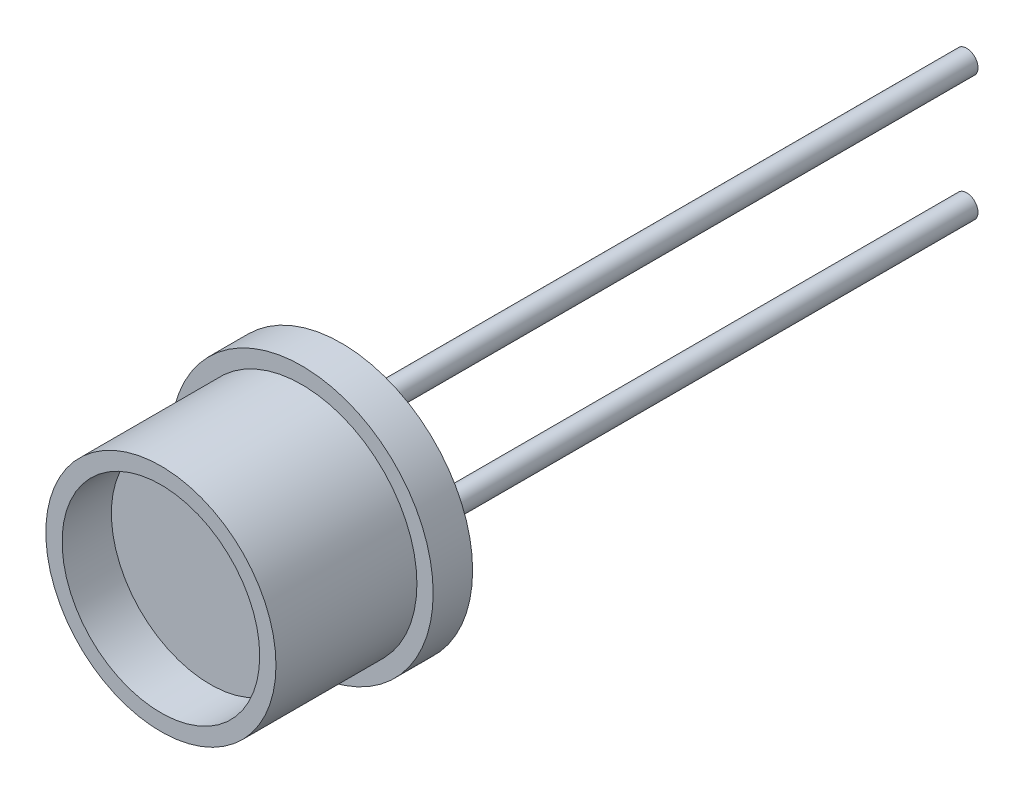
ISO-10303-21;
HEADER;
FILE_DESCRIPTION(('STEP AP214'),'2;1');
FILE_NAME('part.step','',(''),(''),'','','');
FILE_SCHEMA(('AUTOMOTIVE_DESIGN { 1 0 10303 214 1 1 1 1 }'));
ENDSEC;
DATA;
#1=APPLICATION_CONTEXT('core data for automotive mechanical design processes');
#2=APPLICATION_PROTOCOL_DEFINITION('international standard','automotive_design',2000,#1);
#3=PRODUCT_CONTEXT('',#1,'mechanical');
#4=PRODUCT('Part','Part','',(#3));
#5=PRODUCT_RELATED_PRODUCT_CATEGORY('part','',(#4));
#6=PRODUCT_DEFINITION_FORMATION('','',#4);
#7=PRODUCT_DEFINITION_CONTEXT('part definition',#1,'design');
#8=PRODUCT_DEFINITION('design','',#6,#7);
#9=PRODUCT_DEFINITION_SHAPE('','',#8);
#10=(LENGTH_UNIT() NAMED_UNIT(*) SI_UNIT(.MILLI.,.METRE.));
#11=(NAMED_UNIT(*) PLANE_ANGLE_UNIT() SI_UNIT($,.RADIAN.));
#12=(NAMED_UNIT(*) SI_UNIT($,.STERADIAN.) SOLID_ANGLE_UNIT());
#13=UNCERTAINTY_MEASURE_WITH_UNIT(LENGTH_MEASURE(1.E-05),#10,'distance_accuracy_value','');
#14=(GEOMETRIC_REPRESENTATION_CONTEXT(3) GLOBAL_UNCERTAINTY_ASSIGNED_CONTEXT((#13)) GLOBAL_UNIT_ASSIGNED_CONTEXT((#10,
#11,#12)) REPRESENTATION_CONTEXT('',''));
#15=CARTESIAN_POINT('',(0.,0.,0.));
#16=DIRECTION('',(0.,0.,1.));
#17=DIRECTION('',(1.,0.,0.));
#18=AXIS2_PLACEMENT_3D('',#15,#16,#17);
#19=CARTESIAN_POINT('',(0.,0.,0.8));
#20=DIRECTION('',(0.,0.,-1.));
#21=DIRECTION('',(-1.,0.,0.));
#22=AXIS2_PLACEMENT_3D('',#19,#20,#21);
#23=CYLINDRICAL_SURFACE('',#22,2.665);
#24=CARTESIAN_POINT('',(0.,0.,0.8));
#25=DIRECTION('',(0.,0.,1.));
#26=DIRECTION('',(1.,0.,0.));
#27=AXIS2_PLACEMENT_3D('',#24,#25,#26);
#28=CIRCLE('',#27,2.665);
#29=CARTESIAN_POINT('',(2.665,0.,0.8));
#30=VERTEX_POINT('',#29);
#31=EDGE_CURVE('E59',#30,#30,#28,.T.);
#32=ORIENTED_EDGE('',*,*,#31,.F.);
#33=EDGE_LOOP('',(#32));
#34=FACE_BOUND('',#33,.T.);
#35=CARTESIAN_POINT('',(0.,0.,0.));
#36=DIRECTION('',(0.,0.,1.));
#37=DIRECTION('',(1.,0.,0.));
#38=AXIS2_PLACEMENT_3D('',#35,#36,#37);
#39=CIRCLE('',#38,2.665);
#40=CARTESIAN_POINT('',(2.665,0.,0.));
#41=VERTEX_POINT('',#40);
#42=EDGE_CURVE('E56',#41,#41,#39,.T.);
#43=ORIENTED_EDGE('',*,*,#42,.T.);
#44=EDGE_LOOP('',(#43));
#45=FACE_BOUND('',#44,.T.);
#46=ADVANCED_FACE('F39',(#34,#45),#23,.T.);
#47=CARTESIAN_POINT('',(0.,0.,0.8));
#48=DIRECTION('',(0.,0.,1.));
#49=DIRECTION('',(1.,0.,0.));
#50=AXIS2_PLACEMENT_3D('',#47,#48,#49);
#51=PLANE('',#50);
#52=CARTESIAN_POINT('',(0.,0.,0.8));
#53=DIRECTION('',(0.,0.,1.));
#54=DIRECTION('',(1.,0.,0.));
#55=AXIS2_PLACEMENT_3D('',#52,#53,#54);
#56=CIRCLE('',#55,2.335);
#57=CARTESIAN_POINT('',(2.335,0.,0.8));
#58=VERTEX_POINT('',#57);
#59=EDGE_CURVE('E53',#58,#58,#56,.T.);
#60=ORIENTED_EDGE('',*,*,#59,.F.);
#61=EDGE_LOOP('',(#60));
#62=FACE_BOUND('',#61,.T.);
#63=ORIENTED_EDGE('',*,*,#31,.T.);
#64=EDGE_LOOP('',(#63));
#65=FACE_BOUND('',#64,.T.);
#66=ADVANCED_FACE('F106',(#62,#65),#51,.T.);
#67=CARTESIAN_POINT('',(0.,0.,0.));
#68=DIRECTION('',(0.,0.,1.));
#69=DIRECTION('',(1.,0.,0.));
#70=AXIS2_PLACEMENT_3D('',#67,#68,#69);
#71=PLANE('',#70);
#72=CARTESIAN_POINT('',(-1.27,0.,0.));
#73=DIRECTION('',(0.,0.,1.));
#74=DIRECTION('',(1.,0.,0.));
#75=AXIS2_PLACEMENT_3D('',#72,#73,#74);
#76=CIRCLE('',#75,0.23);
#77=CARTESIAN_POINT('',(-1.04,0.,0.));
#78=VERTEX_POINT('',#77);
#79=EDGE_CURVE('E10',#78,#78,#76,.F.);
#80=ORIENTED_EDGE('',*,*,#79,.F.);
#81=EDGE_LOOP('',(#80));
#82=FACE_BOUND('',#81,.T.);
#83=CARTESIAN_POINT('',(0.,-1.27,0.));
#84=DIRECTION('',(0.,0.,1.));
#85=DIRECTION('',(1.,0.,0.));
#86=AXIS2_PLACEMENT_3D('',#83,#84,#85);
#87=CIRCLE('',#86,0.23);
#88=CARTESIAN_POINT('',(0.23,-1.27,0.));
#89=VERTEX_POINT('',#88);
#90=EDGE_CURVE('E45',#89,#89,#87,.F.);
#91=ORIENTED_EDGE('',*,*,#90,.F.);
#92=EDGE_LOOP('',(#91));
#93=FACE_BOUND('',#92,.T.);
#94=CARTESIAN_POINT('',(0.,1.27,0.));
#95=DIRECTION('',(0.,0.,1.));
#96=DIRECTION('',(1.,0.,0.));
#97=AXIS2_PLACEMENT_3D('',#94,#95,#96);
#98=CIRCLE('',#97,0.23);
#99=CARTESIAN_POINT('',(0.23,1.27,0.));
#100=VERTEX_POINT('',#99);
#101=EDGE_CURVE('E49',#100,#100,#98,.F.);
#102=ORIENTED_EDGE('',*,*,#101,.F.);
#103=EDGE_LOOP('',(#102));
#104=FACE_BOUND('',#103,.T.);
#105=ORIENTED_EDGE('',*,*,#42,.F.);
#106=EDGE_LOOP('',(#105));
#107=FACE_BOUND('',#106,.T.);
#108=ADVANCED_FACE('F102',(#82,#93,#104,#107),#71,.F.);
#109=CARTESIAN_POINT('',(0.,0.,3.66));
#110=DIRECTION('',(0.,0.,-1.));
#111=DIRECTION('',(-1.,0.,0.));
#112=AXIS2_PLACEMENT_3D('',#109,#110,#111);
#113=CYLINDRICAL_SURFACE('',#112,2.335);
#114=CARTESIAN_POINT('',(0.,0.,3.66));
#115=DIRECTION('',(0.,0.,1.));
#116=DIRECTION('',(1.,0.,0.));
#117=AXIS2_PLACEMENT_3D('',#114,#115,#116);
#118=CIRCLE('',#117,2.335);
#119=CARTESIAN_POINT('',(2.335,0.,3.66));
#120=VERTEX_POINT('',#119);
#121=EDGE_CURVE('E60',#120,#120,#118,.T.);
#122=ORIENTED_EDGE('',*,*,#121,.F.);
#123=EDGE_LOOP('',(#122));
#124=FACE_BOUND('',#123,.T.);
#125=ORIENTED_EDGE('',*,*,#59,.T.);
#126=EDGE_LOOP('',(#125));
#127=FACE_BOUND('',#126,.T.);
#128=ADVANCED_FACE('F96',(#124,#127),#113,.T.);
#129=CARTESIAN_POINT('',(0.,0.,3.66));
#130=DIRECTION('',(0.,0.,1.));
#131=DIRECTION('',(1.,0.,0.));
#132=AXIS2_PLACEMENT_3D('',#129,#130,#131);
#133=PLANE('',#132);
#134=CARTESIAN_POINT('',(0.,0.,3.66));
#135=DIRECTION('',(0.,0.,1.));
#136=DIRECTION('',(1.,0.,0.));
#137=AXIS2_PLACEMENT_3D('',#134,#135,#136);
#138=CIRCLE('',#137,2.005);
#139=CARTESIAN_POINT('',(2.005,0.,3.66));
#140=VERTEX_POINT('',#139);
#141=EDGE_CURVE('E77',#140,#140,#138,.T.);
#142=ORIENTED_EDGE('',*,*,#141,.F.);
#143=EDGE_LOOP('',(#142));
#144=FACE_BOUND('',#143,.T.);
#145=ORIENTED_EDGE('',*,*,#121,.T.);
#146=EDGE_LOOP('',(#145));
#147=FACE_BOUND('',#146,.T.);
#148=ADVANCED_FACE('F92',(#144,#147),#133,.T.);
#149=CARTESIAN_POINT('',(0.,1.27,-12.69));
#150=DIRECTION('',(0.,0.,1.));
#151=DIRECTION('',(1.,0.,0.));
#152=AXIS2_PLACEMENT_3D('',#149,#150,#151);
#153=CYLINDRICAL_SURFACE('',#152,0.23);
#154=CARTESIAN_POINT('',(0.,1.27,-12.69));
#155=DIRECTION('',(0.,0.,-1.));
#156=DIRECTION('',(-1.,0.,0.));
#157=AXIS2_PLACEMENT_3D('',#154,#155,#156);
#158=CIRCLE('',#157,0.23);
#159=CARTESIAN_POINT('',(-0.23,1.27,-12.69));
#160=VERTEX_POINT('',#159);
#161=EDGE_CURVE('E67',#160,#160,#158,.T.);
#162=ORIENTED_EDGE('',*,*,#161,.F.);
#163=EDGE_LOOP('',(#162));
#164=FACE_BOUND('',#163,.T.);
#165=ORIENTED_EDGE('',*,*,#101,.T.);
#166=EDGE_LOOP('',(#165));
#167=FACE_BOUND('',#166,.T.);
#168=ADVANCED_FACE('F95',(#164,#167),#153,.T.);
#169=CARTESIAN_POINT('',(0.,1.27,-12.69));
#170=DIRECTION('',(0.,0.,-1.));
#171=DIRECTION('',(-1.,0.,0.));
#172=AXIS2_PLACEMENT_3D('',#169,#170,#171);
#173=PLANE('',#172);
#174=ORIENTED_EDGE('',*,*,#161,.T.);
#175=EDGE_LOOP('',(#174));
#176=FACE_BOUND('',#175,.T.);
#177=ADVANCED_FACE('F126',(#176),#173,.T.);
#178=CARTESIAN_POINT('',(0.,-1.27,-12.69));
#179=DIRECTION('',(0.,0.,1.));
#180=DIRECTION('',(-1.,0.,0.));
#181=AXIS2_PLACEMENT_3D('',#178,#179,#180);
#182=CYLINDRICAL_SURFACE('',#181,0.23);
#183=CARTESIAN_POINT('',(0.,-1.27,-12.69));
#184=DIRECTION('',(0.,0.,-1.));
#185=DIRECTION('',(1.,0.,0.));
#186=AXIS2_PLACEMENT_3D('',#183,#184,#185);
#187=CIRCLE('',#186,0.23);
#188=CARTESIAN_POINT('',(0.23,-1.27,-12.69));
#189=VERTEX_POINT('',#188);
#190=EDGE_CURVE('E71',#189,#189,#187,.T.);
#191=ORIENTED_EDGE('',*,*,#190,.F.);
#192=EDGE_LOOP('',(#191));
#193=FACE_BOUND('',#192,.T.);
#194=ORIENTED_EDGE('',*,*,#90,.T.);
#195=EDGE_LOOP('',(#194));
#196=FACE_BOUND('',#195,.T.);
#197=ADVANCED_FACE('F129',(#193,#196),#182,.T.);
#198=CARTESIAN_POINT('',(0.,-1.27,-12.69));
#199=DIRECTION('',(0.,0.,-1.));
#200=DIRECTION('',(1.,0.,0.));
#201=AXIS2_PLACEMENT_3D('',#198,#199,#200);
#202=PLANE('',#201);
#203=ORIENTED_EDGE('',*,*,#190,.T.);
#204=EDGE_LOOP('',(#203));
#205=FACE_BOUND('',#204,.T.);
#206=ADVANCED_FACE('F132',(#205),#202,.T.);
#207=CARTESIAN_POINT('',(-1.27,0.,-12.69));
#208=DIRECTION('',(0.,0.,1.));
#209=DIRECTION('',(0.,1.,0.));
#210=AXIS2_PLACEMENT_3D('',#207,#208,#209);
#211=CYLINDRICAL_SURFACE('',#210,0.23);
#212=CARTESIAN_POINT('',(-1.27,0.,-12.69));
#213=DIRECTION('',(0.,0.,-1.));
#214=DIRECTION('',(0.,-1.,0.));
#215=AXIS2_PLACEMENT_3D('',#212,#213,#214);
#216=CIRCLE('',#215,0.23);
#217=CARTESIAN_POINT('',(-1.27,-0.230000000000004,-12.69));
#218=VERTEX_POINT('',#217);
#219=EDGE_CURVE('E70',#218,#218,#216,.T.);
#220=ORIENTED_EDGE('',*,*,#219,.F.);
#221=EDGE_LOOP('',(#220));
#222=FACE_BOUND('',#221,.T.);
#223=ORIENTED_EDGE('',*,*,#79,.T.);
#224=EDGE_LOOP('',(#223));
#225=FACE_BOUND('',#224,.T.);
#226=ADVANCED_FACE('F136',(#222,#225),#211,.T.);
#227=CARTESIAN_POINT('',(-1.27,0.,-12.69));
#228=DIRECTION('',(0.,0.,-1.));
#229=DIRECTION('',(0.,-1.,0.));
#230=AXIS2_PLACEMENT_3D('',#227,#228,#229);
#231=PLANE('',#230);
#232=ORIENTED_EDGE('',*,*,#219,.T.);
#233=EDGE_LOOP('',(#232));
#234=FACE_BOUND('',#233,.T.);
#235=ADVANCED_FACE('F88',(#234),#231,.T.);
#236=CARTESIAN_POINT('',(0.,0.,2.66));
#237=DIRECTION('',(0.,0.,1.));
#238=DIRECTION('',(1.,0.,0.));
#239=AXIS2_PLACEMENT_3D('',#236,#237,#238);
#240=CYLINDRICAL_SURFACE('',#239,2.005);
#241=CARTESIAN_POINT('',(0.,0.,2.66));
#242=DIRECTION('',(0.,0.,1.));
#243=DIRECTION('',(1.,0.,0.));
#244=AXIS2_PLACEMENT_3D('',#241,#242,#243);
#245=CIRCLE('',#244,2.005);
#246=CARTESIAN_POINT('',(2.005,0.,2.66));
#247=VERTEX_POINT('',#246);
#248=EDGE_CURVE('E74',#247,#247,#245,.T.);
#249=ORIENTED_EDGE('',*,*,#248,.F.);
#250=EDGE_LOOP('',(#249));
#251=FACE_BOUND('',#250,.T.);
#252=ORIENTED_EDGE('',*,*,#141,.T.);
#253=EDGE_LOOP('',(#252));
#254=FACE_BOUND('',#253,.T.);
#255=ADVANCED_FACE('F85',(#251,#254),#240,.F.);
#256=CARTESIAN_POINT('',(0.,0.,2.66));
#257=DIRECTION('',(0.,0.,1.));
#258=DIRECTION('',(1.,0.,0.));
#259=AXIS2_PLACEMENT_3D('',#256,#257,#258);
#260=PLANE('',#259);
#261=ORIENTED_EDGE('',*,*,#248,.T.);
#262=EDGE_LOOP('',(#261));
#263=FACE_BOUND('',#262,.T.);
#264=ADVANCED_FACE('F83',(#263),#260,.T.);
#265=CLOSED_SHELL('',(#46,#66,#108,#128,#148,#168,#177,#197,#206,#226,#235,#255,#264));
#266=MANIFOLD_SOLID_BREP('B2',#265);
#267=ADVANCED_BREP_SHAPE_REPRESENTATION('',(#18,#266),#14);
#268=SHAPE_DEFINITION_REPRESENTATION(#9,#267);
ENDSEC;
END-ISO-10303-21;
